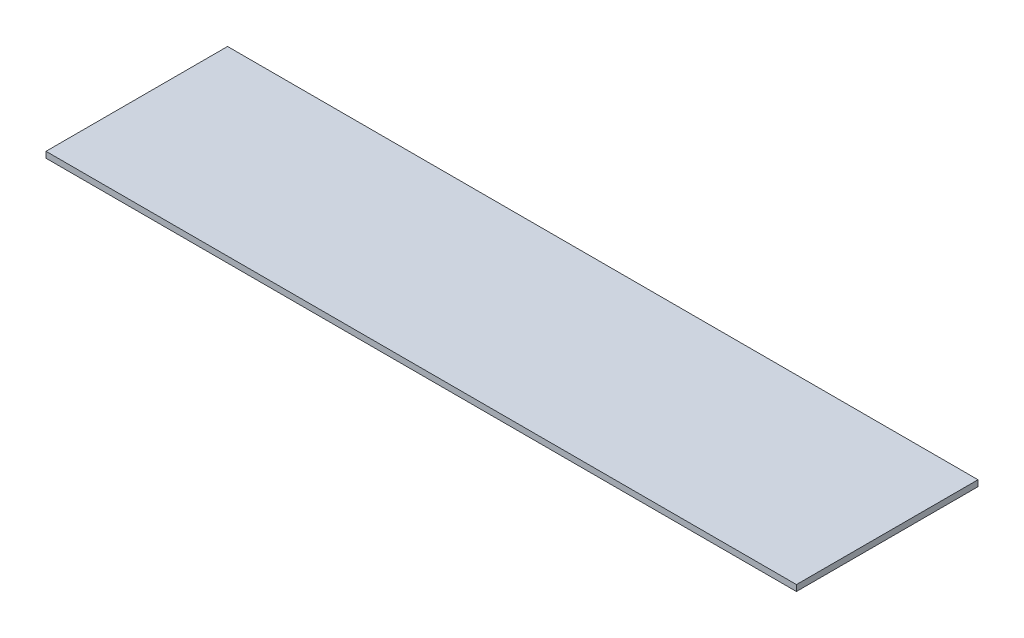
ISO-10303-21;
HEADER;
FILE_DESCRIPTION(('STEP AP214'),'2;1');
FILE_NAME('part.step','',(''),(''),'','','');
FILE_SCHEMA(('AUTOMOTIVE_DESIGN { 1 0 10303 214 1 1 1 1 }'));
ENDSEC;
DATA;
#1=APPLICATION_CONTEXT('core data for automotive mechanical design processes');
#2=APPLICATION_PROTOCOL_DEFINITION('international standard','automotive_design',2000,#1);
#3=PRODUCT_CONTEXT('',#1,'mechanical');
#4=PRODUCT('Part','Part','',(#3));
#5=PRODUCT_RELATED_PRODUCT_CATEGORY('part','',(#4));
#6=PRODUCT_DEFINITION_FORMATION('','',#4);
#7=PRODUCT_DEFINITION_CONTEXT('part definition',#1,'design');
#8=PRODUCT_DEFINITION('design','',#6,#7);
#9=PRODUCT_DEFINITION_SHAPE('','',#8);
#10=(LENGTH_UNIT() NAMED_UNIT(*) SI_UNIT(.MILLI.,.METRE.));
#11=(NAMED_UNIT(*) PLANE_ANGLE_UNIT() SI_UNIT($,.RADIAN.));
#12=(NAMED_UNIT(*) SI_UNIT($,.STERADIAN.) SOLID_ANGLE_UNIT());
#13=UNCERTAINTY_MEASURE_WITH_UNIT(LENGTH_MEASURE(1.E-05),#10,'distance_accuracy_value','');
#14=(GEOMETRIC_REPRESENTATION_CONTEXT(3) GLOBAL_UNCERTAINTY_ASSIGNED_CONTEXT((#13)) GLOBAL_UNIT_ASSIGNED_CONTEXT((#10,
#11,#12)) REPRESENTATION_CONTEXT('',''));
#15=CARTESIAN_POINT('',(0.,0.,0.));
#16=DIRECTION('',(0.,0.,1.));
#17=DIRECTION('',(1.,0.,0.));
#18=AXIS2_PLACEMENT_3D('',#15,#16,#17);
#19=CARTESIAN_POINT('',(393.7,6.35,95.25));
#20=DIRECTION('',(-1.,0.,0.));
#21=DIRECTION('',(0.,0.,1.));
#22=AXIS2_PLACEMENT_3D('',#19,#20,#21);
#23=PLANE('',#22);
#24=DIRECTION('',(0.,0.,-1.));
#25=VECTOR('',#24,1.);
#26=CARTESIAN_POINT('',(393.7,0.,95.25));
#27=LINE('',#26,#25);
#28=CARTESIAN_POINT('',(393.7,0.,95.25));
#29=VERTEX_POINT('',#28);
#30=CARTESIAN_POINT('',(393.7,0.,-95.25));
#31=VERTEX_POINT('',#30);
#32=EDGE_CURVE('E96',#29,#31,#27,.T.);
#33=ORIENTED_EDGE('',*,*,#32,.T.);
#34=DIRECTION('',(0.,-1.,0.));
#35=VECTOR('',#34,1.);
#36=CARTESIAN_POINT('',(393.7,6.35,-95.25));
#37=LINE('',#36,#35);
#38=CARTESIAN_POINT('',(393.7,6.35,-95.25));
#39=VERTEX_POINT('',#38);
#40=EDGE_CURVE('E11',#39,#31,#37,.T.);
#41=ORIENTED_EDGE('',*,*,#40,.F.);
#42=DIRECTION('',(0.,0.,-1.));
#43=VECTOR('',#42,1.);
#44=CARTESIAN_POINT('',(393.7,6.35,95.25));
#45=LINE('',#44,#43);
#46=CARTESIAN_POINT('',(393.7,6.35,95.25));
#47=VERTEX_POINT('',#46);
#48=EDGE_CURVE('E84',#47,#39,#45,.T.);
#49=ORIENTED_EDGE('',*,*,#48,.F.);
#50=DIRECTION('',(0.,-1.,0.));
#51=VECTOR('',#50,1.);
#52=CARTESIAN_POINT('',(393.7,6.35,95.25));
#53=LINE('',#52,#51);
#54=EDGE_CURVE('E92',#47,#29,#53,.T.);
#55=ORIENTED_EDGE('',*,*,#54,.T.);
#56=EDGE_LOOP('',(#33,#41,#49,#55));
#57=FACE_BOUND('',#56,.T.);
#58=ADVANCED_FACE('F33',(#57),#23,.F.);
#59=CARTESIAN_POINT('',(-393.7,6.35,-95.25));
#60=DIRECTION('',(0.,0.,1.));
#61=DIRECTION('',(1.,0.,0.));
#62=AXIS2_PLACEMENT_3D('',#59,#60,#61);
#63=PLANE('',#62);
#64=DIRECTION('',(-1.,0.,0.));
#65=VECTOR('',#64,1.);
#66=CARTESIAN_POINT('',(-393.7,0.,-95.25));
#67=LINE('',#66,#65);
#68=CARTESIAN_POINT('',(-393.7,0.,-95.25));
#69=VERTEX_POINT('',#68);
#70=EDGE_CURVE('E88',#31,#69,#67,.T.);
#71=ORIENTED_EDGE('',*,*,#70,.T.);
#72=DIRECTION('',(0.,-1.,0.));
#73=VECTOR('',#72,1.);
#74=CARTESIAN_POINT('',(-393.7,6.35,-95.25));
#75=LINE('',#74,#73);
#76=CARTESIAN_POINT('',(-393.7,6.35,-95.25));
#77=VERTEX_POINT('',#76);
#78=EDGE_CURVE('E41',#77,#69,#75,.T.);
#79=ORIENTED_EDGE('',*,*,#78,.F.);
#80=DIRECTION('',(-1.,0.,0.));
#81=VECTOR('',#80,1.);
#82=CARTESIAN_POINT('',(-393.7,6.35,-95.25));
#83=LINE('',#82,#81);
#84=EDGE_CURVE('E79',#39,#77,#83,.T.);
#85=ORIENTED_EDGE('',*,*,#84,.F.);
#86=ORIENTED_EDGE('',*,*,#40,.T.);
#87=EDGE_LOOP('',(#71,#79,#85,#86));
#88=FACE_BOUND('',#87,.T.);
#89=ADVANCED_FACE('F87',(#88),#63,.F.);
#90=CARTESIAN_POINT('',(-393.7,6.35,95.25));
#91=DIRECTION('',(1.,0.,0.));
#92=DIRECTION('',(0.,0.,-1.));
#93=AXIS2_PLACEMENT_3D('',#90,#91,#92);
#94=PLANE('',#93);
#95=DIRECTION('',(0.,0.,1.));
#96=VECTOR('',#95,1.);
#97=CARTESIAN_POINT('',(-393.7,0.,95.25));
#98=LINE('',#97,#96);
#99=CARTESIAN_POINT('',(-393.7,0.,95.25));
#100=VERTEX_POINT('',#99);
#101=EDGE_CURVE('E66',#69,#100,#98,.T.);
#102=ORIENTED_EDGE('',*,*,#101,.T.);
#103=DIRECTION('',(0.,-1.,0.));
#104=VECTOR('',#103,1.);
#105=CARTESIAN_POINT('',(-393.7,6.35,95.25));
#106=LINE('',#105,#104);
#107=CARTESIAN_POINT('',(-393.7,6.35,95.25));
#108=VERTEX_POINT('',#107);
#109=EDGE_CURVE('E89',#108,#100,#106,.T.);
#110=ORIENTED_EDGE('',*,*,#109,.F.);
#111=DIRECTION('',(0.,0.,1.));
#112=VECTOR('',#111,1.);
#113=CARTESIAN_POINT('',(-393.7,6.35,95.25));
#114=LINE('',#113,#112);
#115=EDGE_CURVE('E82',#77,#108,#114,.T.);
#116=ORIENTED_EDGE('',*,*,#115,.F.);
#117=ORIENTED_EDGE('',*,*,#78,.T.);
#118=EDGE_LOOP('',(#102,#110,#116,#117));
#119=FACE_BOUND('',#118,.T.);
#120=ADVANCED_FACE('F90',(#119),#94,.F.);
#121=CARTESIAN_POINT('',(-393.7,6.35,95.25));
#122=DIRECTION('',(0.,0.,-1.));
#123=DIRECTION('',(-1.,0.,0.));
#124=AXIS2_PLACEMENT_3D('',#121,#122,#123);
#125=PLANE('',#124);
#126=DIRECTION('',(1.,0.,0.));
#127=VECTOR('',#126,1.);
#128=CARTESIAN_POINT('',(-393.7,0.,95.25));
#129=LINE('',#128,#127);
#130=EDGE_CURVE('E72',#100,#29,#129,.T.);
#131=ORIENTED_EDGE('',*,*,#130,.T.);
#132=ORIENTED_EDGE('',*,*,#54,.F.);
#133=DIRECTION('',(1.,0.,0.));
#134=VECTOR('',#133,1.);
#135=CARTESIAN_POINT('',(-393.7,6.35,95.25));
#136=LINE('',#135,#134);
#137=EDGE_CURVE('E49',#108,#47,#136,.T.);
#138=ORIENTED_EDGE('',*,*,#137,.F.);
#139=ORIENTED_EDGE('',*,*,#109,.T.);
#140=EDGE_LOOP('',(#131,#132,#138,#139));
#141=FACE_BOUND('',#140,.T.);
#142=ADVANCED_FACE('F103',(#141),#125,.F.);
#143=CARTESIAN_POINT('',(0.,6.35,0.));
#144=DIRECTION('',(0.,-1.,0.));
#145=DIRECTION('',(0.,0.,-1.));
#146=AXIS2_PLACEMENT_3D('',#143,#144,#145);
#147=PLANE('',#146);
#148=ORIENTED_EDGE('',*,*,#48,.T.);
#149=ORIENTED_EDGE('',*,*,#84,.T.);
#150=ORIENTED_EDGE('',*,*,#115,.T.);
#151=ORIENTED_EDGE('',*,*,#137,.T.);
#152=EDGE_LOOP('',(#148,#149,#150,#151));
#153=FACE_BOUND('',#152,.T.);
#154=ADVANCED_FACE('F80',(#153),#147,.F.);
#155=CARTESIAN_POINT('',(0.,0.,0.));
#156=DIRECTION('',(0.,-1.,0.));
#157=DIRECTION('',(0.,0.,-1.));
#158=AXIS2_PLACEMENT_3D('',#155,#156,#157);
#159=PLANE('',#158);
#160=ORIENTED_EDGE('',*,*,#32,.F.);
#161=ORIENTED_EDGE('',*,*,#130,.F.);
#162=ORIENTED_EDGE('',*,*,#101,.F.);
#163=ORIENTED_EDGE('',*,*,#70,.F.);
#164=EDGE_LOOP('',(#160,#161,#162,#163));
#165=FACE_BOUND('',#164,.T.);
#166=ADVANCED_FACE('F106',(#165),#159,.T.);
#167=CLOSED_SHELL('',(#58,#89,#120,#142,#154,#166));
#168=MANIFOLD_SOLID_BREP('B2',#167);
#169=ADVANCED_BREP_SHAPE_REPRESENTATION('',(#18,#168),#14);
#170=SHAPE_DEFINITION_REPRESENTATION(#9,#169);
ENDSEC;
END-ISO-10303-21;
